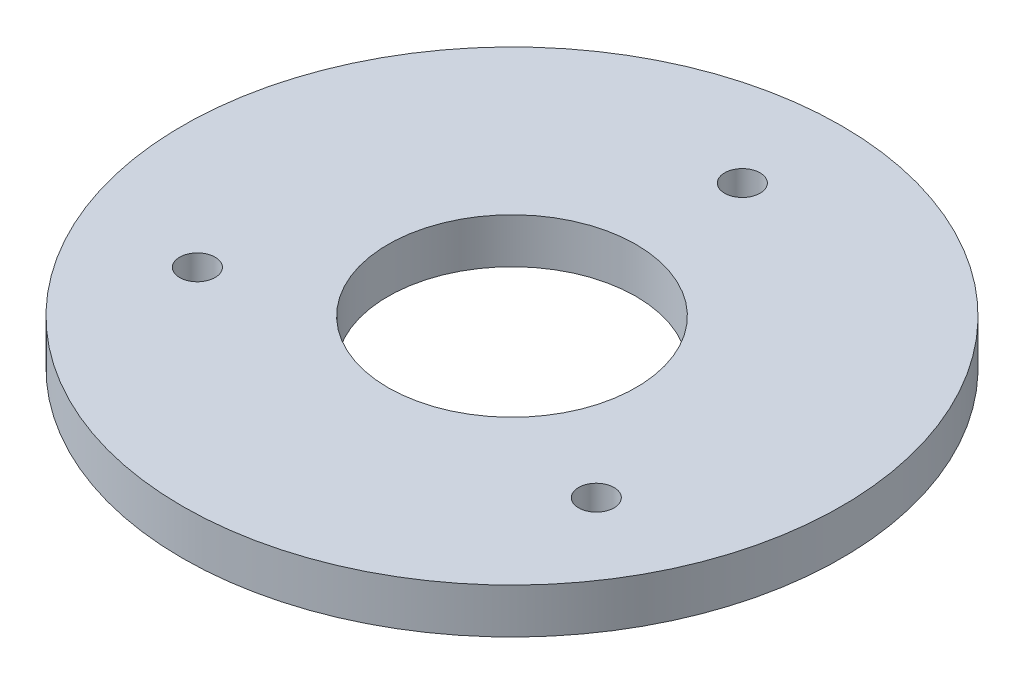
ISO-10303-21;
HEADER;
FILE_DESCRIPTION(('STEP AP214'),'2;1');
FILE_NAME('part.step','',(''),(''),'','','');
FILE_SCHEMA(('AUTOMOTIVE_DESIGN { 1 0 10303 214 1 1 1 1 }'));
ENDSEC;
DATA;
#1=APPLICATION_CONTEXT('core data for automotive mechanical design processes');
#2=APPLICATION_PROTOCOL_DEFINITION('international standard','automotive_design',2000,#1);
#3=PRODUCT_CONTEXT('',#1,'mechanical');
#4=PRODUCT('Part','Part','',(#3));
#5=PRODUCT_RELATED_PRODUCT_CATEGORY('part','',(#4));
#6=PRODUCT_DEFINITION_FORMATION('','',#4);
#7=PRODUCT_DEFINITION_CONTEXT('part definition',#1,'design');
#8=PRODUCT_DEFINITION('design','',#6,#7);
#9=PRODUCT_DEFINITION_SHAPE('','',#8);
#10=(LENGTH_UNIT() NAMED_UNIT(*) SI_UNIT(.MILLI.,.METRE.));
#11=(NAMED_UNIT(*) PLANE_ANGLE_UNIT() SI_UNIT($,.RADIAN.));
#12=(NAMED_UNIT(*) SI_UNIT($,.STERADIAN.) SOLID_ANGLE_UNIT());
#13=UNCERTAINTY_MEASURE_WITH_UNIT(LENGTH_MEASURE(1.E-05),#10,'distance_accuracy_value','');
#14=(GEOMETRIC_REPRESENTATION_CONTEXT(3) GLOBAL_UNCERTAINTY_ASSIGNED_CONTEXT((#13)) GLOBAL_UNIT_ASSIGNED_CONTEXT((#10,
#11,#12)) REPRESENTATION_CONTEXT('',''));
#15=CARTESIAN_POINT('',(0.,0.,0.));
#16=DIRECTION('',(0.,0.,1.));
#17=DIRECTION('',(1.,0.,0.));
#18=AXIS2_PLACEMENT_3D('',#15,#16,#17);
#19=CARTESIAN_POINT('',(0.,6.35,28.));
#20=DIRECTION('',(0.,1.,0.));
#21=DIRECTION('',(0.,0.,1.));
#22=AXIS2_PLACEMENT_3D('',#19,#20,#21);
#23=PLANE('',#22);
#24=CARTESIAN_POINT('',(0.,6.35,0.));
#25=DIRECTION('',(0.,1.,0.));
#26=DIRECTION('',(0.,0.,1.));
#27=AXIS2_PLACEMENT_3D('',#24,#25,#26);
#28=CIRCLE('',#27,46.5);
#29=CARTESIAN_POINT('',(0.,6.35,46.5));
#30=VERTEX_POINT('',#29);
#31=EDGE_CURVE('E38',#30,#30,#28,.T.);
#32=ORIENTED_EDGE('',*,*,#31,.T.);
#33=EDGE_LOOP('',(#32));
#34=FACE_BOUND('',#33,.T.);
#35=CARTESIAN_POINT('',(0.,6.35,0.));
#36=DIRECTION('',(0.,1.,0.));
#37=DIRECTION('',(0.,0.,1.));
#38=AXIS2_PLACEMENT_3D('',#35,#36,#37);
#39=CIRCLE('',#38,17.5);
#40=CARTESIAN_POINT('',(0.,6.35,17.5));
#41=VERTEX_POINT('',#40);
#42=EDGE_CURVE('E51',#41,#41,#39,.T.);
#43=ORIENTED_EDGE('',*,*,#42,.F.);
#44=EDGE_LOOP('',(#43));
#45=FACE_BOUND('',#44,.T.);
#46=CARTESIAN_POINT('',(-28.1458256229942,6.35,16.25));
#47=DIRECTION('',(0.,1.,0.));
#48=DIRECTION('',(0.,0.,1.));
#49=AXIS2_PLACEMENT_3D('',#46,#47,#48);
#50=CIRCLE('',#49,2.50000000000031);
#51=CARTESIAN_POINT('',(-28.1458256229942,6.35,18.7500000000003));
#52=VERTEX_POINT('',#51);
#53=EDGE_CURVE('E10',#52,#52,#50,.T.);
#54=ORIENTED_EDGE('',*,*,#53,.F.);
#55=EDGE_LOOP('',(#54));
#56=FACE_BOUND('',#55,.T.);
#57=CARTESIAN_POINT('',(28.1458256229943,6.35,16.25));
#58=DIRECTION('',(0.,1.,0.));
#59=DIRECTION('',(0.,0.,1.));
#60=AXIS2_PLACEMENT_3D('',#57,#58,#59);
#61=CIRCLE('',#60,2.50000000000015);
#62=CARTESIAN_POINT('',(28.1458256229943,6.35,18.7500000000001));
#63=VERTEX_POINT('',#62);
#64=EDGE_CURVE('E42',#63,#63,#61,.T.);
#65=ORIENTED_EDGE('',*,*,#64,.F.);
#66=EDGE_LOOP('',(#65));
#67=FACE_BOUND('',#66,.T.);
#68=CARTESIAN_POINT('',(0.,6.35,-32.5));
#69=DIRECTION('',(0.,1.,0.));
#70=DIRECTION('',(0.,0.,1.));
#71=AXIS2_PLACEMENT_3D('',#68,#69,#70);
#72=CIRCLE('',#71,2.5);
#73=CARTESIAN_POINT('',(0.,6.35,-30.));
#74=VERTEX_POINT('',#73);
#75=EDGE_CURVE('E47',#74,#74,#72,.T.);
#76=ORIENTED_EDGE('',*,*,#75,.F.);
#77=EDGE_LOOP('',(#76));
#78=FACE_BOUND('',#77,.T.);
#79=ADVANCED_FACE('F34',(#34,#45,#56,#67,#78),#23,.T.);
#80=CARTESIAN_POINT('',(0.,0.,0.));
#81=DIRECTION('',(0.,1.,0.));
#82=DIRECTION('',(0.,0.,1.));
#83=AXIS2_PLACEMENT_3D('',#80,#81,#82);
#84=PLANE('',#83);
#85=CARTESIAN_POINT('',(0.,0.,0.));
#86=DIRECTION('',(0.,1.,0.));
#87=DIRECTION('',(0.,0.,1.));
#88=AXIS2_PLACEMENT_3D('',#85,#86,#87);
#89=CIRCLE('',#88,46.5);
#90=CARTESIAN_POINT('',(0.,0.,46.5));
#91=VERTEX_POINT('',#90);
#92=EDGE_CURVE('E55',#91,#91,#89,.T.);
#93=ORIENTED_EDGE('',*,*,#92,.F.);
#94=EDGE_LOOP('',(#93));
#95=FACE_BOUND('',#94,.T.);
#96=CARTESIAN_POINT('',(0.,0.,-32.5));
#97=DIRECTION('',(0.,1.,0.));
#98=DIRECTION('',(0.,0.,1.));
#99=AXIS2_PLACEMENT_3D('',#96,#97,#98);
#100=CIRCLE('',#99,2.5);
#101=CARTESIAN_POINT('',(0.,0.,-30.));
#102=VERTEX_POINT('',#101);
#103=EDGE_CURVE('E58',#102,#102,#100,.T.);
#104=ORIENTED_EDGE('',*,*,#103,.T.);
#105=EDGE_LOOP('',(#104));
#106=FACE_BOUND('',#105,.T.);
#107=CARTESIAN_POINT('',(0.,0.,0.));
#108=DIRECTION('',(0.,1.,0.));
#109=DIRECTION('',(0.,0.,1.));
#110=AXIS2_PLACEMENT_3D('',#107,#108,#109);
#111=CIRCLE('',#110,17.5);
#112=CARTESIAN_POINT('',(0.,0.,17.5));
#113=VERTEX_POINT('',#112);
#114=EDGE_CURVE('E61',#113,#113,#111,.T.);
#115=ORIENTED_EDGE('',*,*,#114,.T.);
#116=EDGE_LOOP('',(#115));
#117=FACE_BOUND('',#116,.T.);
#118=CARTESIAN_POINT('',(28.1458256229943,0.,16.25));
#119=DIRECTION('',(0.,1.,0.));
#120=DIRECTION('',(0.,0.,1.));
#121=AXIS2_PLACEMENT_3D('',#118,#119,#120);
#122=CIRCLE('',#121,2.50000000000015);
#123=CARTESIAN_POINT('',(28.1458256229943,0.,18.7500000000001));
#124=VERTEX_POINT('',#123);
#125=EDGE_CURVE('E64',#124,#124,#122,.T.);
#126=ORIENTED_EDGE('',*,*,#125,.T.);
#127=EDGE_LOOP('',(#126));
#128=FACE_BOUND('',#127,.T.);
#129=CARTESIAN_POINT('',(-28.1458256229942,0.,16.25));
#130=DIRECTION('',(0.,1.,0.));
#131=DIRECTION('',(0.,0.,1.));
#132=AXIS2_PLACEMENT_3D('',#129,#130,#131);
#133=CIRCLE('',#132,2.50000000000031);
#134=CARTESIAN_POINT('',(-28.1458256229942,0.,18.7500000000003));
#135=VERTEX_POINT('',#134);
#136=EDGE_CURVE('E54',#135,#135,#133,.T.);
#137=ORIENTED_EDGE('',*,*,#136,.T.);
#138=EDGE_LOOP('',(#137));
#139=FACE_BOUND('',#138,.T.);
#140=ADVANCED_FACE('F69',(#95,#106,#117,#128,#139),#84,.F.);
#141=CARTESIAN_POINT('',(0.,12.7,-32.5));
#142=DIRECTION('',(0.,-1.,0.));
#143=DIRECTION('',(0.,0.,-1.));
#144=AXIS2_PLACEMENT_3D('',#141,#142,#143);
#145=CYLINDRICAL_SURFACE('',#144,2.5);
#146=ORIENTED_EDGE('',*,*,#103,.F.);
#147=EDGE_LOOP('',(#146));
#148=FACE_BOUND('',#147,.T.);
#149=ORIENTED_EDGE('',*,*,#75,.T.);
#150=EDGE_LOOP('',(#149));
#151=FACE_BOUND('',#150,.T.);
#152=ADVANCED_FACE('F82',(#148,#151),#145,.F.);
#153=CARTESIAN_POINT('',(28.1458256229943,12.7,16.25));
#154=DIRECTION('',(0.,-1.,0.));
#155=DIRECTION('',(0.,0.,-1.));
#156=AXIS2_PLACEMENT_3D('',#153,#154,#155);
#157=CYLINDRICAL_SURFACE('',#156,2.50000000000015);
#158=ORIENTED_EDGE('',*,*,#125,.F.);
#159=EDGE_LOOP('',(#158));
#160=FACE_BOUND('',#159,.T.);
#161=ORIENTED_EDGE('',*,*,#64,.T.);
#162=EDGE_LOOP('',(#161));
#163=FACE_BOUND('',#162,.T.);
#164=ADVANCED_FACE('F74',(#160,#163),#157,.F.);
#165=CARTESIAN_POINT('',(-28.1458256229942,12.7,16.25));
#166=DIRECTION('',(0.,-1.,0.));
#167=DIRECTION('',(0.,0.,-1.));
#168=AXIS2_PLACEMENT_3D('',#165,#166,#167);
#169=CYLINDRICAL_SURFACE('',#168,2.50000000000031);
#170=ORIENTED_EDGE('',*,*,#136,.F.);
#171=EDGE_LOOP('',(#170));
#172=FACE_BOUND('',#171,.T.);
#173=ORIENTED_EDGE('',*,*,#53,.T.);
#174=EDGE_LOOP('',(#173));
#175=FACE_BOUND('',#174,.T.);
#176=ADVANCED_FACE('F71',(#172,#175),#169,.F.);
#177=CARTESIAN_POINT('',(0.,12.7,0.));
#178=DIRECTION('',(0.,-1.,0.));
#179=DIRECTION('',(0.,0.,-1.));
#180=AXIS2_PLACEMENT_3D('',#177,#178,#179);
#181=CYLINDRICAL_SURFACE('',#180,17.5);
#182=ORIENTED_EDGE('',*,*,#114,.F.);
#183=EDGE_LOOP('',(#182));
#184=FACE_BOUND('',#183,.T.);
#185=ORIENTED_EDGE('',*,*,#42,.T.);
#186=EDGE_LOOP('',(#185));
#187=FACE_BOUND('',#186,.T.);
#188=ADVANCED_FACE('F73',(#184,#187),#181,.F.);
#189=CARTESIAN_POINT('',(0.,12.7,0.));
#190=DIRECTION('',(0.,-1.,0.));
#191=DIRECTION('',(0.,0.,-1.));
#192=AXIS2_PLACEMENT_3D('',#189,#190,#191);
#193=CYLINDRICAL_SURFACE('',#192,46.5);
#194=ORIENTED_EDGE('',*,*,#92,.T.);
#195=EDGE_LOOP('',(#194));
#196=FACE_BOUND('',#195,.T.);
#197=ORIENTED_EDGE('',*,*,#31,.F.);
#198=EDGE_LOOP('',(#197));
#199=FACE_BOUND('',#198,.T.);
#200=ADVANCED_FACE('F36',(#196,#199),#193,.T.);
#201=CLOSED_SHELL('',(#79,#140,#152,#164,#176,#188,#200));
#202=MANIFOLD_SOLID_BREP('B2',#201);
#203=ADVANCED_BREP_SHAPE_REPRESENTATION('',(#18,#202),#14);
#204=SHAPE_DEFINITION_REPRESENTATION(#9,#203);
ENDSEC;
END-ISO-10303-21;
